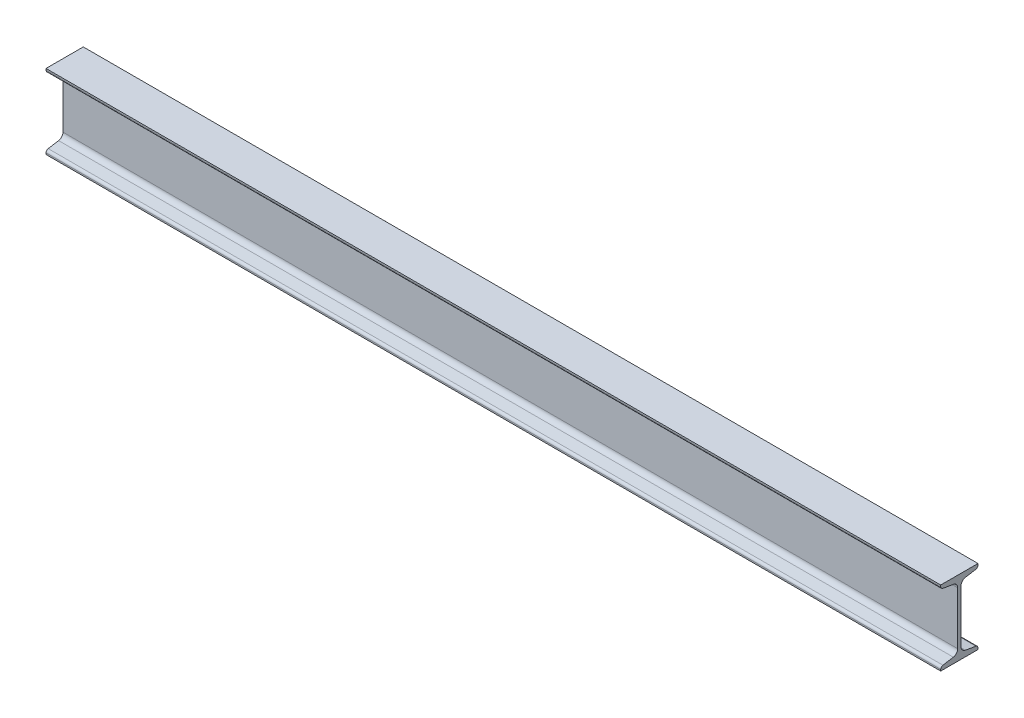
ISO-10303-21;
HEADER;
FILE_DESCRIPTION(('STEP AP214'),'2;1');
FILE_NAME('part.step','',(''),(''),'','','');
FILE_SCHEMA(('AUTOMOTIVE_DESIGN { 1 0 10303 214 1 1 1 1 }'));
ENDSEC;
DATA;
#1=APPLICATION_CONTEXT('core data for automotive mechanical design processes');
#2=APPLICATION_PROTOCOL_DEFINITION('international standard','automotive_design',2000,#1);
#3=PRODUCT_CONTEXT('',#1,'mechanical');
#4=PRODUCT('Part','Part','',(#3));
#5=PRODUCT_RELATED_PRODUCT_CATEGORY('part','',(#4));
#6=PRODUCT_DEFINITION_FORMATION('','',#4);
#7=PRODUCT_DEFINITION_CONTEXT('part definition',#1,'design');
#8=PRODUCT_DEFINITION('design','',#6,#7);
#9=PRODUCT_DEFINITION_SHAPE('','',#8);
#10=(LENGTH_UNIT() NAMED_UNIT(*) SI_UNIT(.MILLI.,.METRE.));
#11=(NAMED_UNIT(*) PLANE_ANGLE_UNIT() SI_UNIT($,.RADIAN.));
#12=(NAMED_UNIT(*) SI_UNIT($,.STERADIAN.) SOLID_ANGLE_UNIT());
#13=UNCERTAINTY_MEASURE_WITH_UNIT(LENGTH_MEASURE(1.E-05),#10,'distance_accuracy_value','');
#14=(GEOMETRIC_REPRESENTATION_CONTEXT(3) GLOBAL_UNCERTAINTY_ASSIGNED_CONTEXT((#13)) GLOBAL_UNIT_ASSIGNED_CONTEXT((#10,
#11,#12)) REPRESENTATION_CONTEXT('',''));
#15=CARTESIAN_POINT('',(0.,0.,0.));
#16=DIRECTION('',(0.,0.,1.));
#17=DIRECTION('',(1.,0.,0.));
#18=AXIS2_PLACEMENT_3D('',#15,#16,#17);
#19=CARTESIAN_POINT('',(1200.,-50.,-25.));
#20=DIRECTION('',(0.,1.,0.));
#21=DIRECTION('',(0.,0.,1.));
#22=AXIS2_PLACEMENT_3D('',#19,#20,#21);
#23=PLANE('',#22);
#24=DIRECTION('',(0.,0.,-1.));
#25=VECTOR('',#24,1.);
#26=CARTESIAN_POINT('',(0.,-50.,-25.));
#27=LINE('',#26,#25);
#28=CARTESIAN_POINT('',(0.,-50.,25.));
#29=VERTEX_POINT('',#28);
#30=CARTESIAN_POINT('',(0.,-50.,-25.));
#31=VERTEX_POINT('',#30);
#32=EDGE_CURVE('E265',#29,#31,#27,.T.);
#33=ORIENTED_EDGE('',*,*,#32,.T.);
#34=DIRECTION('',(-1.,0.,0.));
#35=VECTOR('',#34,1.);
#36=CARTESIAN_POINT('',(1200.,-50.,-25.));
#37=LINE('',#36,#35);
#38=CARTESIAN_POINT('',(1200.,-50.,-25.));
#39=VERTEX_POINT('',#38);
#40=EDGE_CURVE('E13',#39,#31,#37,.T.);
#41=ORIENTED_EDGE('',*,*,#40,.F.);
#42=DIRECTION('',(0.,0.,-1.));
#43=VECTOR('',#42,1.);
#44=CARTESIAN_POINT('',(1200.,-50.,-25.));
#45=LINE('',#44,#43);
#46=CARTESIAN_POINT('',(1200.,-50.,25.));
#47=VERTEX_POINT('',#46);
#48=EDGE_CURVE('E303',#47,#39,#45,.T.);
#49=ORIENTED_EDGE('',*,*,#48,.F.);
#50=DIRECTION('',(-1.,0.,0.));
#51=VECTOR('',#50,1.);
#52=CARTESIAN_POINT('',(1200.,-50.,25.));
#53=LINE('',#52,#51);
#54=EDGE_CURVE('E261',#47,#29,#53,.T.);
#55=ORIENTED_EDGE('',*,*,#54,.T.);
#56=EDGE_LOOP('',(#33,#41,#49,#55));
#57=FACE_BOUND('',#56,.T.);
#58=ADVANCED_FACE('F97',(#57),#23,.F.);
#59=CARTESIAN_POINT('',(1200.,-48.0606710225333,-25.));
#60=DIRECTION('',(0.,0.,1.));
#61=DIRECTION('',(0.,-1.,0.));
#62=AXIS2_PLACEMENT_3D('',#59,#60,#61);
#63=PLANE('',#62);
#64=DIRECTION('',(0.,1.,0.));
#65=VECTOR('',#64,1.);
#66=CARTESIAN_POINT('',(0.,-48.0606710225333,-25.));
#67=LINE('',#66,#65);
#68=CARTESIAN_POINT('',(0.,-48.0606710225333,-25.));
#69=VERTEX_POINT('',#68);
#70=EDGE_CURVE('E268',#31,#69,#67,.T.);
#71=ORIENTED_EDGE('',*,*,#70,.T.);
#72=DIRECTION('',(-1.,0.,0.));
#73=VECTOR('',#72,1.);
#74=CARTESIAN_POINT('',(1200.,-48.0606710225333,-25.));
#75=LINE('',#74,#73);
#76=CARTESIAN_POINT('',(1200.,-48.0606710225333,-25.));
#77=VERTEX_POINT('',#76);
#78=EDGE_CURVE('E105',#77,#69,#75,.T.);
#79=ORIENTED_EDGE('',*,*,#78,.F.);
#80=DIRECTION('',(0.,1.,0.));
#81=VECTOR('',#80,1.);
#82=CARTESIAN_POINT('',(1200.,-48.0606710225333,-25.));
#83=LINE('',#82,#81);
#84=EDGE_CURVE('E192',#39,#77,#83,.T.);
#85=ORIENTED_EDGE('',*,*,#84,.F.);
#86=ORIENTED_EDGE('',*,*,#40,.T.);
#87=EDGE_LOOP('',(#71,#79,#85,#86));
#88=FACE_BOUND('',#87,.T.);
#89=ADVANCED_FACE('F421',(#88),#63,.F.);
#90=CARTESIAN_POINT('',(1200.,-48.0606710225333,-21.5));
#91=DIRECTION('',(-1.,0.,0.));
#92=DIRECTION('',(0.,0.,1.));
#93=AXIS2_PLACEMENT_3D('',#90,#91,#92);
#94=CYLINDRICAL_SURFACE('',#93,3.5);
#95=CARTESIAN_POINT('',(0.,-48.0606710225333,-21.5));
#96=DIRECTION('',(1.,0.,0.));
#97=DIRECTION('',(0.,0.,-1.));
#98=AXIS2_PLACEMENT_3D('',#95,#96,#97);
#99=CIRCLE('',#98,3.5);
#100=CARTESIAN_POINT('',(0.,-44.6082990961307,-22.0754372961387));
#101=VERTEX_POINT('',#100);
#102=EDGE_CURVE('E270',#69,#101,#99,.T.);
#103=ORIENTED_EDGE('',*,*,#102,.T.);
#104=DIRECTION('',(-1.,0.,0.));
#105=VECTOR('',#104,1.);
#106=CARTESIAN_POINT('',(1200.,-44.6082990961307,-22.0754372961387));
#107=LINE('',#106,#105);
#108=CARTESIAN_POINT('',(1200.,-44.6082990961307,-22.0754372961387));
#109=VERTEX_POINT('',#108);
#110=EDGE_CURVE('E346',#109,#101,#107,.T.);
#111=ORIENTED_EDGE('',*,*,#110,.F.);
#112=CARTESIAN_POINT('',(1200.,-48.0606710225333,-21.5));
#113=DIRECTION('',(1.,0.,0.));
#114=DIRECTION('',(0.,0.,-1.));
#115=AXIS2_PLACEMENT_3D('',#112,#113,#114);
#116=CIRCLE('',#115,3.5);
#117=EDGE_CURVE('E354',#77,#109,#116,.T.);
#118=ORIENTED_EDGE('',*,*,#117,.F.);
#119=ORIENTED_EDGE('',*,*,#78,.T.);
#120=EDGE_LOOP('',(#103,#111,#118,#119));
#121=FACE_BOUND('',#120,.T.);
#122=ADVANCED_FACE('F352',(#121),#94,.T.);
#123=CARTESIAN_POINT('',(1200.,-42.2787438528052,-8.09912540772265));
#124=DIRECTION('',(0.,-0.986391978972163,0.164410656039623));
#125=DIRECTION('',(0.,-0.164410656039623,-0.986391978972163));
#126=AXIS2_PLACEMENT_3D('',#123,#124,#125);
#127=PLANE('',#126);
#128=DIRECTION('',(0.,0.164410656039623,0.986391978972163));
#129=VECTOR('',#128,1.);
#130=CARTESIAN_POINT('',(0.,-42.2787438528052,-8.09912540772265));
#131=LINE('',#130,#129);
#132=CARTESIAN_POINT('',(0.,-42.2787438528052,-8.09912540772265));
#133=VERTEX_POINT('',#132);
#134=EDGE_CURVE('E272',#101,#133,#131,.T.);
#135=ORIENTED_EDGE('',*,*,#134,.T.);
#136=DIRECTION('',(-1.,0.,0.));
#137=VECTOR('',#136,1.);
#138=CARTESIAN_POINT('',(1200.,-42.2787438528052,-8.09912540772265));
#139=LINE('',#138,#137);
#140=CARTESIAN_POINT('',(1200.,-42.2787438528052,-8.09912540772265));
#141=VERTEX_POINT('',#140);
#142=EDGE_CURVE('E343',#141,#133,#139,.T.);
#143=ORIENTED_EDGE('',*,*,#142,.F.);
#144=DIRECTION('',(0.,0.164410656039623,0.986391978972163));
#145=VECTOR('',#144,1.);
#146=CARTESIAN_POINT('',(1200.,-42.2787438528052,-8.09912540772265));
#147=LINE('',#146,#145);
#148=EDGE_CURVE('E372',#109,#141,#147,.T.);
#149=ORIENTED_EDGE('',*,*,#148,.F.);
#150=ORIENTED_EDGE('',*,*,#110,.T.);
#151=EDGE_LOOP('',(#135,#143,#149,#150));
#152=FACE_BOUND('',#151,.T.);
#153=ADVANCED_FACE('F363',(#152),#127,.F.);
#154=CARTESIAN_POINT('',(1200.,-35.374,-9.25000000000001));
#155=DIRECTION('',(-1.,0.,0.));
#156=DIRECTION('',(0.,0.,1.));
#157=AXIS2_PLACEMENT_3D('',#154,#155,#156);
#158=CYLINDRICAL_SURFACE('',#157,7.);
#159=CARTESIAN_POINT('',(0.,-35.374,-9.25000000000001));
#160=DIRECTION('',(-1.,0.,0.));
#161=DIRECTION('',(0.,0.,-1.));
#162=AXIS2_PLACEMENT_3D('',#159,#160,#161);
#163=CIRCLE('',#162,7.);
#164=CARTESIAN_POINT('',(0.,-35.374,-2.25000000000001));
#165=VERTEX_POINT('',#164);
#166=EDGE_CURVE('E274',#133,#165,#163,.T.);
#167=ORIENTED_EDGE('',*,*,#166,.T.);
#168=DIRECTION('',(-1.,0.,0.));
#169=VECTOR('',#168,1.);
#170=CARTESIAN_POINT('',(1200.,-35.374,-2.25000000000001));
#171=LINE('',#170,#169);
#172=CARTESIAN_POINT('',(1200.,-35.374,-2.25000000000001));
#173=VERTEX_POINT('',#172);
#174=EDGE_CURVE('E340',#173,#165,#171,.T.);
#175=ORIENTED_EDGE('',*,*,#174,.F.);
#176=CARTESIAN_POINT('',(1200.,-35.374,-9.25000000000001));
#177=DIRECTION('',(-1.,0.,0.));
#178=DIRECTION('',(0.,0.,-1.));
#179=AXIS2_PLACEMENT_3D('',#176,#177,#178);
#180=CIRCLE('',#179,7.);
#181=EDGE_CURVE('E369',#141,#173,#180,.T.);
#182=ORIENTED_EDGE('',*,*,#181,.F.);
#183=ORIENTED_EDGE('',*,*,#142,.T.);
#184=EDGE_LOOP('',(#167,#175,#182,#183));
#185=FACE_BOUND('',#184,.T.);
#186=ADVANCED_FACE('F367',(#185),#158,.F.);
#187=CARTESIAN_POINT('',(1200.,35.374,-2.24999999999999));
#188=DIRECTION('',(0.,0.,1.));
#189=DIRECTION('',(0.,-1.,0.));
#190=AXIS2_PLACEMENT_3D('',#187,#188,#189);
#191=PLANE('',#190);
#192=DIRECTION('',(0.,1.,0.));
#193=VECTOR('',#192,1.);
#194=CARTESIAN_POINT('',(0.,35.374,-2.24999999999999));
#195=LINE('',#194,#193);
#196=CARTESIAN_POINT('',(0.,35.374,-2.24999999999999));
#197=VERTEX_POINT('',#196);
#198=EDGE_CURVE('E276',#165,#197,#195,.T.);
#199=ORIENTED_EDGE('',*,*,#198,.T.);
#200=DIRECTION('',(-1.,0.,0.));
#201=VECTOR('',#200,1.);
#202=CARTESIAN_POINT('',(1200.,35.374,-2.24999999999999));
#203=LINE('',#202,#201);
#204=CARTESIAN_POINT('',(1200.,35.374,-2.24999999999999));
#205=VERTEX_POINT('',#204);
#206=EDGE_CURVE('E337',#205,#197,#203,.T.);
#207=ORIENTED_EDGE('',*,*,#206,.F.);
#208=DIRECTION('',(0.,1.,0.));
#209=VECTOR('',#208,1.);
#210=CARTESIAN_POINT('',(1200.,35.374,-2.24999999999999));
#211=LINE('',#210,#209);
#212=EDGE_CURVE('E371',#173,#205,#211,.T.);
#213=ORIENTED_EDGE('',*,*,#212,.F.);
#214=ORIENTED_EDGE('',*,*,#174,.T.);
#215=EDGE_LOOP('',(#199,#207,#213,#214));
#216=FACE_BOUND('',#215,.T.);
#217=ADVANCED_FACE('F434',(#216),#191,.F.);
#218=CARTESIAN_POINT('',(1200.,35.374,-9.24999999999999));
#219=DIRECTION('',(-1.,0.,0.));
#220=DIRECTION('',(0.,0.,1.));
#221=AXIS2_PLACEMENT_3D('',#218,#219,#220);
#222=CYLINDRICAL_SURFACE('',#221,7.);
#223=CARTESIAN_POINT('',(0.,35.374,-9.24999999999999));
#224=DIRECTION('',(-1.,0.,0.));
#225=DIRECTION('',(0.,0.,-1.));
#226=AXIS2_PLACEMENT_3D('',#223,#224,#225);
#227=CIRCLE('',#226,7.);
#228=CARTESIAN_POINT('',(0.,42.2787438528051,-8.09912540772263));
#229=VERTEX_POINT('',#228);
#230=EDGE_CURVE('E278',#197,#229,#227,.T.);
#231=ORIENTED_EDGE('',*,*,#230,.T.);
#232=DIRECTION('',(-1.,0.,0.));
#233=VECTOR('',#232,1.);
#234=CARTESIAN_POINT('',(1200.,42.2787438528051,-8.09912540772263));
#235=LINE('',#234,#233);
#236=CARTESIAN_POINT('',(1200.,42.2787438528051,-8.09912540772263));
#237=VERTEX_POINT('',#236);
#238=EDGE_CURVE('E334',#237,#229,#235,.T.);
#239=ORIENTED_EDGE('',*,*,#238,.F.);
#240=CARTESIAN_POINT('',(1200.,35.374,-9.24999999999999));
#241=DIRECTION('',(-1.,0.,0.));
#242=DIRECTION('',(0.,0.,-1.));
#243=AXIS2_PLACEMENT_3D('',#240,#241,#242);
#244=CIRCLE('',#243,7.);
#245=EDGE_CURVE('E374',#205,#237,#244,.T.);
#246=ORIENTED_EDGE('',*,*,#245,.F.);
#247=ORIENTED_EDGE('',*,*,#206,.T.);
#248=EDGE_LOOP('',(#231,#239,#246,#247));
#249=FACE_BOUND('',#248,.T.);
#250=ADVANCED_FACE('F437',(#249),#222,.F.);
#251=CARTESIAN_POINT('',(1200.,44.6082990961307,-22.0754372961387));
#252=DIRECTION('',(0.,0.986391978972163,0.164410656039623));
#253=DIRECTION('',(0.,-0.164410656039623,0.986391978972163));
#254=AXIS2_PLACEMENT_3D('',#251,#252,#253);
#255=PLANE('',#254);
#256=DIRECTION('',(0.,0.164410656039623,-0.986391978972163));
#257=VECTOR('',#256,1.);
#258=CARTESIAN_POINT('',(0.,44.6082990961307,-22.0754372961387));
#259=LINE('',#258,#257);
#260=CARTESIAN_POINT('',(0.,44.6082990961307,-22.0754372961387));
#261=VERTEX_POINT('',#260);
#262=EDGE_CURVE('E280',#229,#261,#259,.T.);
#263=ORIENTED_EDGE('',*,*,#262,.T.);
#264=DIRECTION('',(-1.,0.,0.));
#265=VECTOR('',#264,1.);
#266=CARTESIAN_POINT('',(1200.,44.6082990961307,-22.0754372961387));
#267=LINE('',#266,#265);
#268=CARTESIAN_POINT('',(1200.,44.6082990961307,-22.0754372961387));
#269=VERTEX_POINT('',#268);
#270=EDGE_CURVE('E331',#269,#261,#267,.T.);
#271=ORIENTED_EDGE('',*,*,#270,.F.);
#272=DIRECTION('',(0.,0.164410656039623,-0.986391978972163));
#273=VECTOR('',#272,1.);
#274=CARTESIAN_POINT('',(1200.,44.6082990961307,-22.0754372961387));
#275=LINE('',#274,#273);
#276=EDGE_CURVE('E380',#237,#269,#275,.T.);
#277=ORIENTED_EDGE('',*,*,#276,.F.);
#278=ORIENTED_EDGE('',*,*,#238,.T.);
#279=EDGE_LOOP('',(#263,#271,#277,#278));
#280=FACE_BOUND('',#279,.T.);
#281=ADVANCED_FACE('F441',(#280),#255,.F.);
#282=CARTESIAN_POINT('',(1200.,48.0606710225333,-21.5));
#283=DIRECTION('',(-1.,0.,0.));
#284=DIRECTION('',(0.,0.,1.));
#285=AXIS2_PLACEMENT_3D('',#282,#283,#284);
#286=CYLINDRICAL_SURFACE('',#285,3.5);
#287=CARTESIAN_POINT('',(0.,48.0606710225333,-21.5));
#288=DIRECTION('',(1.,0.,0.));
#289=DIRECTION('',(0.,0.,-1.));
#290=AXIS2_PLACEMENT_3D('',#287,#288,#289);
#291=CIRCLE('',#290,3.5);
#292=CARTESIAN_POINT('',(0.,48.0606710225333,-25.));
#293=VERTEX_POINT('',#292);
#294=EDGE_CURVE('E282',#261,#293,#291,.T.);
#295=ORIENTED_EDGE('',*,*,#294,.T.);
#296=DIRECTION('',(-1.,0.,0.));
#297=VECTOR('',#296,1.);
#298=CARTESIAN_POINT('',(1200.,48.0606710225333,-25.));
#299=LINE('',#298,#297);
#300=CARTESIAN_POINT('',(1200.,48.0606710225333,-25.));
#301=VERTEX_POINT('',#300);
#302=EDGE_CURVE('E328',#301,#293,#299,.T.);
#303=ORIENTED_EDGE('',*,*,#302,.F.);
#304=CARTESIAN_POINT('',(1200.,48.0606710225333,-21.5));
#305=DIRECTION('',(1.,0.,0.));
#306=DIRECTION('',(0.,0.,-1.));
#307=AXIS2_PLACEMENT_3D('',#304,#305,#306);
#308=CIRCLE('',#307,3.5);
#309=EDGE_CURVE('E382',#269,#301,#308,.T.);
#310=ORIENTED_EDGE('',*,*,#309,.F.);
#311=ORIENTED_EDGE('',*,*,#270,.T.);
#312=EDGE_LOOP('',(#295,#303,#310,#311));
#313=FACE_BOUND('',#312,.T.);
#314=ADVANCED_FACE('F445',(#313),#286,.T.);
#315=CARTESIAN_POINT('',(1200.,50.,-25.));
#316=DIRECTION('',(0.,0.,1.));
#317=DIRECTION('',(0.,-1.,0.));
#318=AXIS2_PLACEMENT_3D('',#315,#316,#317);
#319=PLANE('',#318);
#320=DIRECTION('',(0.,1.,0.));
#321=VECTOR('',#320,1.);
#322=CARTESIAN_POINT('',(0.,50.,-25.));
#323=LINE('',#322,#321);
#324=CARTESIAN_POINT('',(0.,50.,-25.));
#325=VERTEX_POINT('',#324);
#326=EDGE_CURVE('E284',#293,#325,#323,.T.);
#327=ORIENTED_EDGE('',*,*,#326,.T.);
#328=DIRECTION('',(-1.,0.,0.));
#329=VECTOR('',#328,1.);
#330=CARTESIAN_POINT('',(1200.,50.,-25.));
#331=LINE('',#330,#329);
#332=CARTESIAN_POINT('',(1200.,50.,-25.));
#333=VERTEX_POINT('',#332);
#334=EDGE_CURVE('E325',#333,#325,#331,.T.);
#335=ORIENTED_EDGE('',*,*,#334,.F.);
#336=DIRECTION('',(0.,1.,0.));
#337=VECTOR('',#336,1.);
#338=CARTESIAN_POINT('',(1200.,50.,-25.));
#339=LINE('',#338,#337);
#340=EDGE_CURVE('E384',#301,#333,#339,.T.);
#341=ORIENTED_EDGE('',*,*,#340,.F.);
#342=ORIENTED_EDGE('',*,*,#302,.T.);
#343=EDGE_LOOP('',(#327,#335,#341,#342));
#344=FACE_BOUND('',#343,.T.);
#345=ADVANCED_FACE('F449',(#344),#319,.F.);
#346=CARTESIAN_POINT('',(1200.,50.,25.));
#347=DIRECTION('',(0.,-1.,0.));
#348=DIRECTION('',(0.,0.,-1.));
#349=AXIS2_PLACEMENT_3D('',#346,#347,#348);
#350=PLANE('',#349);
#351=DIRECTION('',(0.,0.,1.));
#352=VECTOR('',#351,1.);
#353=CARTESIAN_POINT('',(0.,50.,25.));
#354=LINE('',#353,#352);
#355=CARTESIAN_POINT('',(0.,50.,25.));
#356=VERTEX_POINT('',#355);
#357=EDGE_CURVE('E286',#325,#356,#354,.T.);
#358=ORIENTED_EDGE('',*,*,#357,.T.);
#359=DIRECTION('',(-1.,0.,0.));
#360=VECTOR('',#359,1.);
#361=CARTESIAN_POINT('',(1200.,50.,25.));
#362=LINE('',#361,#360);
#363=CARTESIAN_POINT('',(1200.,50.,25.));
#364=VERTEX_POINT('',#363);
#365=EDGE_CURVE('E322',#364,#356,#362,.T.);
#366=ORIENTED_EDGE('',*,*,#365,.F.);
#367=DIRECTION('',(0.,0.,1.));
#368=VECTOR('',#367,1.);
#369=CARTESIAN_POINT('',(1200.,50.,25.));
#370=LINE('',#369,#368);
#371=EDGE_CURVE('E386',#333,#364,#370,.T.);
#372=ORIENTED_EDGE('',*,*,#371,.F.);
#373=ORIENTED_EDGE('',*,*,#334,.T.);
#374=EDGE_LOOP('',(#358,#366,#372,#373));
#375=FACE_BOUND('',#374,.T.);
#376=ADVANCED_FACE('F453',(#375),#350,.F.);
#377=CARTESIAN_POINT('',(1200.,48.0606710225333,25.));
#378=DIRECTION('',(0.,0.,-1.));
#379=DIRECTION('',(0.,1.,0.));
#380=AXIS2_PLACEMENT_3D('',#377,#378,#379);
#381=PLANE('',#380);
#382=DIRECTION('',(0.,-1.,0.));
#383=VECTOR('',#382,1.);
#384=CARTESIAN_POINT('',(0.,48.0606710225333,25.));
#385=LINE('',#384,#383);
#386=CARTESIAN_POINT('',(0.,48.0606710225333,25.));
#387=VERTEX_POINT('',#386);
#388=EDGE_CURVE('E288',#356,#387,#385,.T.);
#389=ORIENTED_EDGE('',*,*,#388,.T.);
#390=DIRECTION('',(-1.,0.,0.));
#391=VECTOR('',#390,1.);
#392=CARTESIAN_POINT('',(1200.,48.0606710225333,25.));
#393=LINE('',#392,#391);
#394=CARTESIAN_POINT('',(1200.,48.0606710225333,25.));
#395=VERTEX_POINT('',#394);
#396=EDGE_CURVE('E319',#395,#387,#393,.T.);
#397=ORIENTED_EDGE('',*,*,#396,.F.);
#398=DIRECTION('',(0.,-1.,0.));
#399=VECTOR('',#398,1.);
#400=CARTESIAN_POINT('',(1200.,48.0606710225333,25.));
#401=LINE('',#400,#399);
#402=EDGE_CURVE('E388',#364,#395,#401,.T.);
#403=ORIENTED_EDGE('',*,*,#402,.F.);
#404=ORIENTED_EDGE('',*,*,#365,.T.);
#405=EDGE_LOOP('',(#389,#397,#403,#404));
#406=FACE_BOUND('',#405,.T.);
#407=ADVANCED_FACE('F457',(#406),#381,.F.);
#408=CARTESIAN_POINT('',(1200.,48.0606710225333,21.5));
#409=DIRECTION('',(-1.,0.,0.));
#410=DIRECTION('',(0.,0.,1.));
#411=AXIS2_PLACEMENT_3D('',#408,#409,#410);
#412=CYLINDRICAL_SURFACE('',#411,3.5);
#413=CARTESIAN_POINT('',(0.,48.0606710225333,21.5));
#414=DIRECTION('',(1.,0.,0.));
#415=DIRECTION('',(0.,0.,1.));
#416=AXIS2_PLACEMENT_3D('',#413,#414,#415);
#417=CIRCLE('',#416,3.5);
#418=CARTESIAN_POINT('',(0.,44.6082990961307,22.0754372961387));
#419=VERTEX_POINT('',#418);
#420=EDGE_CURVE('E290',#387,#419,#417,.T.);
#421=ORIENTED_EDGE('',*,*,#420,.T.);
#422=DIRECTION('',(-1.,0.,0.));
#423=VECTOR('',#422,1.);
#424=CARTESIAN_POINT('',(1200.,44.6082990961307,22.0754372961387));
#425=LINE('',#424,#423);
#426=CARTESIAN_POINT('',(1200.,44.6082990961307,22.0754372961387));
#427=VERTEX_POINT('',#426);
#428=EDGE_CURVE('E316',#427,#419,#425,.T.);
#429=ORIENTED_EDGE('',*,*,#428,.F.);
#430=CARTESIAN_POINT('',(1200.,48.0606710225333,21.5));
#431=DIRECTION('',(1.,0.,0.));
#432=DIRECTION('',(0.,0.,1.));
#433=AXIS2_PLACEMENT_3D('',#430,#431,#432);
#434=CIRCLE('',#433,3.5);
#435=EDGE_CURVE('E390',#395,#427,#434,.T.);
#436=ORIENTED_EDGE('',*,*,#435,.F.);
#437=ORIENTED_EDGE('',*,*,#396,.T.);
#438=EDGE_LOOP('',(#421,#429,#436,#437));
#439=FACE_BOUND('',#438,.T.);
#440=ADVANCED_FACE('F461',(#439),#412,.T.);
#441=CARTESIAN_POINT('',(1200.,42.2787438528051,8.09912540772265));
#442=DIRECTION('',(0.,0.986391978972163,-0.164410656039623));
#443=DIRECTION('',(0.,0.164410656039623,0.986391978972163));
#444=AXIS2_PLACEMENT_3D('',#441,#442,#443);
#445=PLANE('',#444);
#446=DIRECTION('',(0.,-0.164410656039623,-0.986391978972163));
#447=VECTOR('',#446,1.);
#448=CARTESIAN_POINT('',(0.,42.2787438528051,8.09912540772265));
#449=LINE('',#448,#447);
#450=CARTESIAN_POINT('',(0.,42.2787438528051,8.09912540772265));
#451=VERTEX_POINT('',#450);
#452=EDGE_CURVE('E292',#419,#451,#449,.T.);
#453=ORIENTED_EDGE('',*,*,#452,.T.);
#454=DIRECTION('',(-1.,0.,0.));
#455=VECTOR('',#454,1.);
#456=CARTESIAN_POINT('',(1200.,42.2787438528051,8.09912540772265));
#457=LINE('',#456,#455);
#458=CARTESIAN_POINT('',(1200.,42.2787438528051,8.09912540772265));
#459=VERTEX_POINT('',#458);
#460=EDGE_CURVE('E313',#459,#451,#457,.T.);
#461=ORIENTED_EDGE('',*,*,#460,.F.);
#462=DIRECTION('',(0.,-0.164410656039623,-0.986391978972163));
#463=VECTOR('',#462,1.);
#464=CARTESIAN_POINT('',(1200.,42.2787438528051,8.09912540772265));
#465=LINE('',#464,#463);
#466=EDGE_CURVE('E392',#427,#459,#465,.T.);
#467=ORIENTED_EDGE('',*,*,#466,.F.);
#468=ORIENTED_EDGE('',*,*,#428,.T.);
#469=EDGE_LOOP('',(#453,#461,#467,#468));
#470=FACE_BOUND('',#469,.T.);
#471=ADVANCED_FACE('F465',(#470),#445,.F.);
#472=CARTESIAN_POINT('',(1200.,35.374,9.25000000000001));
#473=DIRECTION('',(-1.,0.,0.));
#474=DIRECTION('',(0.,0.,1.));
#475=AXIS2_PLACEMENT_3D('',#472,#473,#474);
#476=CYLINDRICAL_SURFACE('',#475,7.);
#477=CARTESIAN_POINT('',(0.,35.374,9.25000000000001));
#478=DIRECTION('',(-1.,0.,0.));
#479=DIRECTION('',(0.,0.,-1.));
#480=AXIS2_PLACEMENT_3D('',#477,#478,#479);
#481=CIRCLE('',#480,7.);
#482=CARTESIAN_POINT('',(0.,35.374,2.25000000000001));
#483=VERTEX_POINT('',#482);
#484=EDGE_CURVE('E294',#451,#483,#481,.T.);
#485=ORIENTED_EDGE('',*,*,#484,.T.);
#486=DIRECTION('',(-1.,0.,0.));
#487=VECTOR('',#486,1.);
#488=CARTESIAN_POINT('',(1200.,35.374,2.25000000000001));
#489=LINE('',#488,#487);
#490=CARTESIAN_POINT('',(1200.,35.374,2.25000000000001));
#491=VERTEX_POINT('',#490);
#492=EDGE_CURVE('E310',#491,#483,#489,.T.);
#493=ORIENTED_EDGE('',*,*,#492,.F.);
#494=CARTESIAN_POINT('',(1200.,35.374,9.25000000000001));
#495=DIRECTION('',(-1.,0.,0.));
#496=DIRECTION('',(0.,0.,-1.));
#497=AXIS2_PLACEMENT_3D('',#494,#495,#496);
#498=CIRCLE('',#497,7.);
#499=EDGE_CURVE('E394',#459,#491,#498,.T.);
#500=ORIENTED_EDGE('',*,*,#499,.F.);
#501=ORIENTED_EDGE('',*,*,#460,.T.);
#502=EDGE_LOOP('',(#485,#493,#500,#501));
#503=FACE_BOUND('',#502,.T.);
#504=ADVANCED_FACE('F469',(#503),#476,.F.);
#505=CARTESIAN_POINT('',(1200.,-35.374,2.24999999999999));
#506=DIRECTION('',(0.,0.,-1.));
#507=DIRECTION('',(0.,1.,0.));
#508=AXIS2_PLACEMENT_3D('',#505,#506,#507);
#509=PLANE('',#508);
#510=DIRECTION('',(0.,-1.,0.));
#511=VECTOR('',#510,1.);
#512=CARTESIAN_POINT('',(0.,-35.374,2.24999999999999));
#513=LINE('',#512,#511);
#514=CARTESIAN_POINT('',(0.,-35.374,2.24999999999999));
#515=VERTEX_POINT('',#514);
#516=EDGE_CURVE('E296',#483,#515,#513,.T.);
#517=ORIENTED_EDGE('',*,*,#516,.T.);
#518=DIRECTION('',(-1.,0.,0.));
#519=VECTOR('',#518,1.);
#520=CARTESIAN_POINT('',(1200.,-35.374,2.24999999999999));
#521=LINE('',#520,#519);
#522=CARTESIAN_POINT('',(1200.,-35.374,2.24999999999999));
#523=VERTEX_POINT('',#522);
#524=EDGE_CURVE('E307',#523,#515,#521,.T.);
#525=ORIENTED_EDGE('',*,*,#524,.F.);
#526=DIRECTION('',(0.,-1.,0.));
#527=VECTOR('',#526,1.);
#528=CARTESIAN_POINT('',(1200.,-35.374,2.24999999999999));
#529=LINE('',#528,#527);
#530=EDGE_CURVE('E396',#491,#523,#529,.T.);
#531=ORIENTED_EDGE('',*,*,#530,.F.);
#532=ORIENTED_EDGE('',*,*,#492,.T.);
#533=EDGE_LOOP('',(#517,#525,#531,#532));
#534=FACE_BOUND('',#533,.T.);
#535=ADVANCED_FACE('F402',(#534),#509,.F.);
#536=CARTESIAN_POINT('',(1200.,-35.374,9.25));
#537=DIRECTION('',(-1.,0.,0.));
#538=DIRECTION('',(0.,0.,1.));
#539=AXIS2_PLACEMENT_3D('',#536,#537,#538);
#540=CYLINDRICAL_SURFACE('',#539,7.00000000000001);
#541=CARTESIAN_POINT('',(0.,-35.374,9.25));
#542=DIRECTION('',(-1.,0.,0.));
#543=DIRECTION('',(0.,0.,-1.));
#544=AXIS2_PLACEMENT_3D('',#541,#542,#543);
#545=CIRCLE('',#544,7.00000000000001);
#546=CARTESIAN_POINT('',(0.,-42.2787438528052,8.09912540772263));
#547=VERTEX_POINT('',#546);
#548=EDGE_CURVE('E298',#515,#547,#545,.T.);
#549=ORIENTED_EDGE('',*,*,#548,.T.);
#550=DIRECTION('',(-1.,0.,0.));
#551=VECTOR('',#550,1.);
#552=CARTESIAN_POINT('',(1200.,-42.2787438528052,8.09912540772263));
#553=LINE('',#552,#551);
#554=CARTESIAN_POINT('',(1200.,-42.2787438528052,8.09912540772263));
#555=VERTEX_POINT('',#554);
#556=EDGE_CURVE('E256',#555,#547,#553,.T.);
#557=ORIENTED_EDGE('',*,*,#556,.F.);
#558=CARTESIAN_POINT('',(1200.,-35.374,9.25));
#559=DIRECTION('',(-1.,0.,0.));
#560=DIRECTION('',(0.,0.,-1.));
#561=AXIS2_PLACEMENT_3D('',#558,#559,#560);
#562=CIRCLE('',#561,7.00000000000001);
#563=EDGE_CURVE('E247',#523,#555,#562,.T.);
#564=ORIENTED_EDGE('',*,*,#563,.F.);
#565=ORIENTED_EDGE('',*,*,#524,.T.);
#566=EDGE_LOOP('',(#549,#557,#564,#565));
#567=FACE_BOUND('',#566,.T.);
#568=ADVANCED_FACE('F406',(#567),#540,.F.);
#569=CARTESIAN_POINT('',(1200.,-44.6082990961307,22.0754372961387));
#570=DIRECTION('',(0.,-0.986391978972163,-0.164410656039623));
#571=DIRECTION('',(0.,0.164410656039623,-0.986391978972163));
#572=AXIS2_PLACEMENT_3D('',#569,#570,#571);
#573=PLANE('',#572);
#574=DIRECTION('',(0.,-0.164410656039623,0.986391978972163));
#575=VECTOR('',#574,1.);
#576=CARTESIAN_POINT('',(0.,-44.6082990961307,22.0754372961387));
#577=LINE('',#576,#575);
#578=CARTESIAN_POINT('',(0.,-44.6082990961307,22.0754372961387));
#579=VERTEX_POINT('',#578);
#580=EDGE_CURVE('E255',#547,#579,#577,.T.);
#581=ORIENTED_EDGE('',*,*,#580,.T.);
#582=DIRECTION('',(-1.,0.,0.));
#583=VECTOR('',#582,1.);
#584=CARTESIAN_POINT('',(1200.,-44.6082990961307,22.0754372961387));
#585=LINE('',#584,#583);
#586=CARTESIAN_POINT('',(1200.,-44.6082990961307,22.0754372961387));
#587=VERTEX_POINT('',#586);
#588=EDGE_CURVE('E252',#587,#579,#585,.T.);
#589=ORIENTED_EDGE('',*,*,#588,.F.);
#590=DIRECTION('',(0.,-0.164410656039623,0.986391978972163));
#591=VECTOR('',#590,1.);
#592=CARTESIAN_POINT('',(1200.,-44.6082990961307,22.0754372961387));
#593=LINE('',#592,#591);
#594=EDGE_CURVE('E241',#555,#587,#593,.T.);
#595=ORIENTED_EDGE('',*,*,#594,.F.);
#596=ORIENTED_EDGE('',*,*,#556,.T.);
#597=EDGE_LOOP('',(#581,#589,#595,#596));
#598=FACE_BOUND('',#597,.T.);
#599=ADVANCED_FACE('F253',(#598),#573,.F.);
#600=CARTESIAN_POINT('',(1200.,-48.0606710225333,21.5));
#601=DIRECTION('',(-1.,0.,0.));
#602=DIRECTION('',(0.,0.,1.));
#603=AXIS2_PLACEMENT_3D('',#600,#601,#602);
#604=CYLINDRICAL_SURFACE('',#603,3.5);
#605=CARTESIAN_POINT('',(0.,-48.0606710225333,21.5));
#606=DIRECTION('',(1.,0.,0.));
#607=DIRECTION('',(0.,0.,1.));
#608=AXIS2_PLACEMENT_3D('',#605,#606,#607);
#609=CIRCLE('',#608,3.5);
#610=CARTESIAN_POINT('',(0.,-48.0606710225333,25.));
#611=VERTEX_POINT('',#610);
#612=EDGE_CURVE('E178',#579,#611,#609,.T.);
#613=ORIENTED_EDGE('',*,*,#612,.T.);
#614=DIRECTION('',(-1.,0.,0.));
#615=VECTOR('',#614,1.);
#616=CARTESIAN_POINT('',(1200.,-48.0606710225333,25.));
#617=LINE('',#616,#615);
#618=CARTESIAN_POINT('',(1200.,-48.0606710225333,25.));
#619=VERTEX_POINT('',#618);
#620=EDGE_CURVE('E257',#619,#611,#617,.T.);
#621=ORIENTED_EDGE('',*,*,#620,.F.);
#622=CARTESIAN_POINT('',(1200.,-48.0606710225333,21.5));
#623=DIRECTION('',(1.,0.,0.));
#624=DIRECTION('',(0.,0.,1.));
#625=AXIS2_PLACEMENT_3D('',#622,#623,#624);
#626=CIRCLE('',#625,3.5);
#627=EDGE_CURVE('E245',#587,#619,#626,.T.);
#628=ORIENTED_EDGE('',*,*,#627,.F.);
#629=ORIENTED_EDGE('',*,*,#588,.T.);
#630=EDGE_LOOP('',(#613,#621,#628,#629));
#631=FACE_BOUND('',#630,.T.);
#632=ADVANCED_FACE('F259',(#631),#604,.T.);
#633=CARTESIAN_POINT('',(1200.,-50.,25.));
#634=DIRECTION('',(0.,0.,-1.));
#635=DIRECTION('',(0.,1.,0.));
#636=AXIS2_PLACEMENT_3D('',#633,#634,#635);
#637=PLANE('',#636);
#638=DIRECTION('',(0.,-1.,0.));
#639=VECTOR('',#638,1.);
#640=CARTESIAN_POINT('',(0.,-50.,25.));
#641=LINE('',#640,#639);
#642=EDGE_CURVE('E184',#611,#29,#641,.T.);
#643=ORIENTED_EDGE('',*,*,#642,.T.);
#644=ORIENTED_EDGE('',*,*,#54,.F.);
#645=DIRECTION('',(0.,-1.,0.));
#646=VECTOR('',#645,1.);
#647=CARTESIAN_POINT('',(1200.,-50.,25.));
#648=LINE('',#647,#646);
#649=EDGE_CURVE('E113',#619,#47,#648,.T.);
#650=ORIENTED_EDGE('',*,*,#649,.F.);
#651=ORIENTED_EDGE('',*,*,#620,.T.);
#652=EDGE_LOOP('',(#643,#644,#650,#651));
#653=FACE_BOUND('',#652,.T.);
#654=ADVANCED_FACE('F410',(#653),#637,.F.);
#655=CARTESIAN_POINT('',(1200.,-48.0606710225333,21.5));
#656=DIRECTION('',(-1.,0.,0.));
#657=DIRECTION('',(0.,0.,1.));
#658=AXIS2_PLACEMENT_3D('',#655,#656,#657);
#659=PLANE('',#658);
#660=ORIENTED_EDGE('',*,*,#48,.T.);
#661=ORIENTED_EDGE('',*,*,#84,.T.);
#662=ORIENTED_EDGE('',*,*,#117,.T.);
#663=ORIENTED_EDGE('',*,*,#148,.T.);
#664=ORIENTED_EDGE('',*,*,#181,.T.);
#665=ORIENTED_EDGE('',*,*,#212,.T.);
#666=ORIENTED_EDGE('',*,*,#245,.T.);
#667=ORIENTED_EDGE('',*,*,#276,.T.);
#668=ORIENTED_EDGE('',*,*,#309,.T.);
#669=ORIENTED_EDGE('',*,*,#340,.T.);
#670=ORIENTED_EDGE('',*,*,#371,.T.);
#671=ORIENTED_EDGE('',*,*,#402,.T.);
#672=ORIENTED_EDGE('',*,*,#435,.T.);
#673=ORIENTED_EDGE('',*,*,#466,.T.);
#674=ORIENTED_EDGE('',*,*,#499,.T.);
#675=ORIENTED_EDGE('',*,*,#530,.T.);
#676=ORIENTED_EDGE('',*,*,#563,.T.);
#677=ORIENTED_EDGE('',*,*,#594,.T.);
#678=ORIENTED_EDGE('',*,*,#627,.T.);
#679=ORIENTED_EDGE('',*,*,#649,.T.);
#680=EDGE_LOOP('',(#660,#661,#662,#663,#664,#665,#666,#667,#668,#669,#670,#671,#672,#673,#674,
#675,#676,#677,#678,#679));
#681=FACE_BOUND('',#680,.T.);
#682=ADVANCED_FACE('F243',(#681),#659,.F.);
#683=CARTESIAN_POINT('',(0.,-48.0606710225333,21.5));
#684=DIRECTION('',(-1.,0.,0.));
#685=DIRECTION('',(0.,0.,1.));
#686=AXIS2_PLACEMENT_3D('',#683,#684,#685);
#687=PLANE('',#686);
#688=ORIENTED_EDGE('',*,*,#32,.F.);
#689=ORIENTED_EDGE('',*,*,#642,.F.);
#690=ORIENTED_EDGE('',*,*,#612,.F.);
#691=ORIENTED_EDGE('',*,*,#580,.F.);
#692=ORIENTED_EDGE('',*,*,#548,.F.);
#693=ORIENTED_EDGE('',*,*,#516,.F.);
#694=ORIENTED_EDGE('',*,*,#484,.F.);
#695=ORIENTED_EDGE('',*,*,#452,.F.);
#696=ORIENTED_EDGE('',*,*,#420,.F.);
#697=ORIENTED_EDGE('',*,*,#388,.F.);
#698=ORIENTED_EDGE('',*,*,#357,.F.);
#699=ORIENTED_EDGE('',*,*,#326,.F.);
#700=ORIENTED_EDGE('',*,*,#294,.F.);
#701=ORIENTED_EDGE('',*,*,#262,.F.);
#702=ORIENTED_EDGE('',*,*,#230,.F.);
#703=ORIENTED_EDGE('',*,*,#198,.F.);
#704=ORIENTED_EDGE('',*,*,#166,.F.);
#705=ORIENTED_EDGE('',*,*,#134,.F.);
#706=ORIENTED_EDGE('',*,*,#102,.F.);
#707=ORIENTED_EDGE('',*,*,#70,.F.);
#708=EDGE_LOOP('',(#688,#689,#690,#691,#692,#693,#694,#695,#696,#697,#698,#699,#700,#701,#702,
#703,#704,#705,#706,#707));
#709=FACE_BOUND('',#708,.T.);
#710=ADVANCED_FACE('F358',(#709),#687,.T.);
#711=CLOSED_SHELL('',(#58,#89,#122,#153,#186,#217,#250,#281,#314,#345,#376,#407,#440,#471,#504,
#535,#568,#599,#632,#654,#682,#710));
#712=MANIFOLD_SOLID_BREP('B2',#711);
#713=ADVANCED_BREP_SHAPE_REPRESENTATION('',(#18,#712),#14);
#714=SHAPE_DEFINITION_REPRESENTATION(#9,#713);
ENDSEC;
END-ISO-10303-21;
